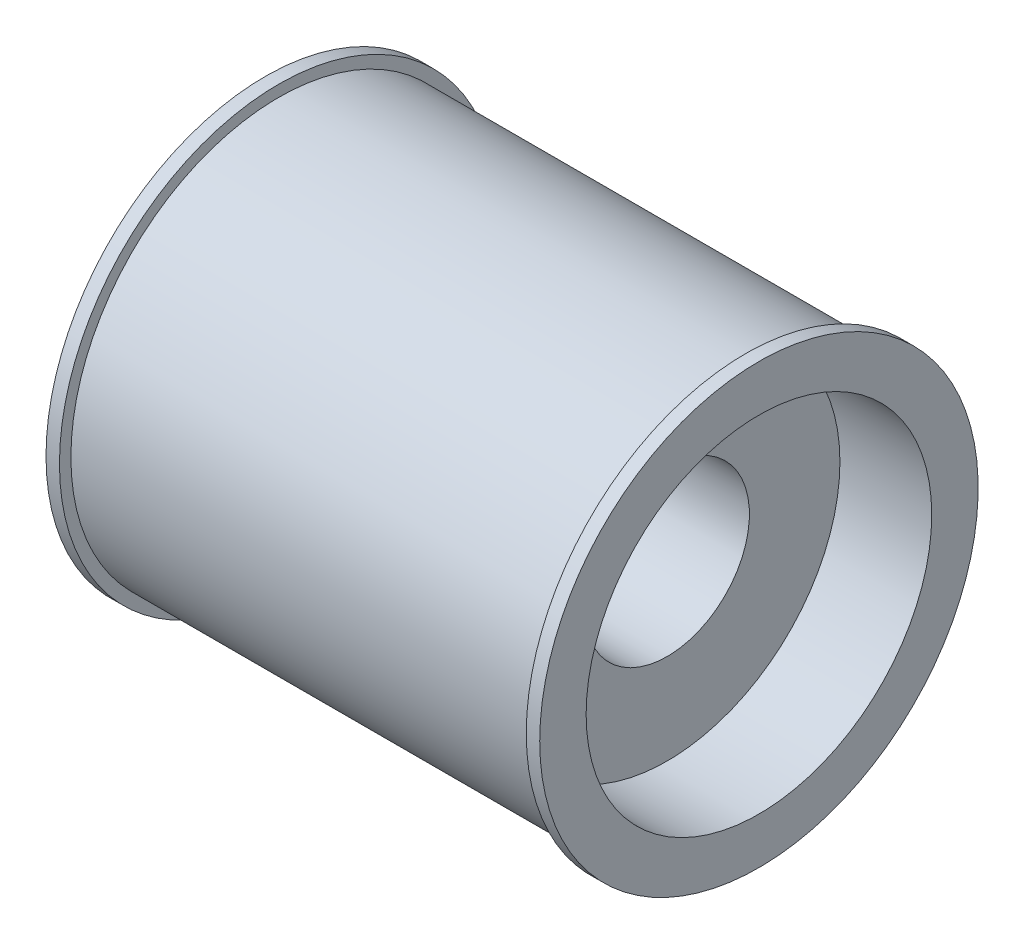
ISO-10303-21;
HEADER;
FILE_DESCRIPTION(('STEP AP214'),'2;1');
FILE_NAME('part.step','',(''),(''),'','','');
FILE_SCHEMA(('AUTOMOTIVE_DESIGN { 1 0 10303 214 1 1 1 1 }'));
ENDSEC;
DATA;
#1=APPLICATION_CONTEXT('core data for automotive mechanical design processes');
#2=APPLICATION_PROTOCOL_DEFINITION('international standard','automotive_design',2000,#1);
#3=PRODUCT_CONTEXT('',#1,'mechanical');
#4=PRODUCT('Part','Part','',(#3));
#5=PRODUCT_RELATED_PRODUCT_CATEGORY('part','',(#4));
#6=PRODUCT_DEFINITION_FORMATION('','',#4);
#7=PRODUCT_DEFINITION_CONTEXT('part definition',#1,'design');
#8=PRODUCT_DEFINITION('design','',#6,#7);
#9=PRODUCT_DEFINITION_SHAPE('','',#8);
#10=(LENGTH_UNIT() NAMED_UNIT(*) SI_UNIT(.MILLI.,.METRE.));
#11=(NAMED_UNIT(*) PLANE_ANGLE_UNIT() SI_UNIT($,.RADIAN.));
#12=(NAMED_UNIT(*) SI_UNIT($,.STERADIAN.) SOLID_ANGLE_UNIT());
#13=UNCERTAINTY_MEASURE_WITH_UNIT(LENGTH_MEASURE(1.E-05),#10,'distance_accuracy_value','');
#14=(GEOMETRIC_REPRESENTATION_CONTEXT(3) GLOBAL_UNCERTAINTY_ASSIGNED_CONTEXT((#13)) GLOBAL_UNIT_ASSIGNED_CONTEXT((#10,
#11,#12)) REPRESENTATION_CONTEXT('',''));
#15=CARTESIAN_POINT('',(0.,0.,0.));
#16=DIRECTION('',(0.,0.,1.));
#17=DIRECTION('',(1.,0.,0.));
#18=AXIS2_PLACEMENT_3D('',#15,#16,#17);
#19=CARTESIAN_POINT('',(-28.3651293747546,26.6416062425833,0.));
#20=DIRECTION('',(-1.,0.,0.));
#21=DIRECTION('',(0.,0.,1.));
#22=AXIS2_PLACEMENT_3D('',#19,#20,#21);
#23=PLANE('',#22);
#24=CARTESIAN_POINT('',(-28.3651293747546,0.,0.));
#25=DIRECTION('',(-1.,0.,0.));
#26=DIRECTION('',(0.,0.,1.));
#27=AXIS2_PLACEMENT_3D('',#24,#25,#26);
#28=CIRCLE('',#27,26.6416062425833);
#29=CARTESIAN_POINT('',(-28.3651293747546,0.,26.6416062425833));
#30=VERTEX_POINT('',#29);
#31=EDGE_CURVE('E88',#30,#30,#28,.T.);
#32=ORIENTED_EDGE('',*,*,#31,.F.);
#33=EDGE_LOOP('',(#32));
#34=FACE_BOUND('',#33,.T.);
#35=CARTESIAN_POINT('',(-28.3651293747546,0.,0.));
#36=DIRECTION('',(-1.,0.,0.));
#37=DIRECTION('',(0.,0.,1.));
#38=AXIS2_PLACEMENT_3D('',#35,#36,#37);
#39=CIRCLE('',#38,25.2519662111247);
#40=CARTESIAN_POINT('',(-28.3651293747546,0.,25.2519662111247));
#41=VERTEX_POINT('',#40);
#42=EDGE_CURVE('E10',#41,#41,#39,.T.);
#43=ORIENTED_EDGE('',*,*,#42,.T.);
#44=EDGE_LOOP('',(#43));
#45=FACE_BOUND('',#44,.T.);
#46=ADVANCED_FACE('F37',(#34,#45),#23,.F.);
#47=CARTESIAN_POINT('',(0.,0.,0.));
#48=DIRECTION('',(-1.,0.,0.));
#49=DIRECTION('',(0.,0.,1.));
#50=AXIS2_PLACEMENT_3D('',#47,#48,#49);
#51=CYLINDRICAL_SURFACE('',#50,25.2519662111247);
#52=ORIENTED_EDGE('',*,*,#42,.F.);
#53=EDGE_LOOP('',(#52));
#54=FACE_BOUND('',#53,.T.);
#55=CARTESIAN_POINT('',(28.3651293747546,0.,0.));
#56=DIRECTION('',(-1.,0.,0.));
#57=DIRECTION('',(0.,0.,1.));
#58=AXIS2_PLACEMENT_3D('',#55,#56,#57);
#59=CIRCLE('',#58,25.2519662111247);
#60=CARTESIAN_POINT('',(28.3651293747546,0.,25.2519662111247));
#61=VERTEX_POINT('',#60);
#62=EDGE_CURVE('E44',#61,#61,#59,.T.);
#63=ORIENTED_EDGE('',*,*,#62,.T.);
#64=EDGE_LOOP('',(#63));
#65=FACE_BOUND('',#64,.T.);
#66=ADVANCED_FACE('F96',(#54,#65),#51,.T.);
#67=CARTESIAN_POINT('',(28.3651293747546,26.6416062425833,0.));
#68=DIRECTION('',(1.,0.,0.));
#69=DIRECTION('',(0.,0.,-1.));
#70=AXIS2_PLACEMENT_3D('',#67,#68,#69);
#71=PLANE('',#70);
#72=ORIENTED_EDGE('',*,*,#62,.F.);
#73=EDGE_LOOP('',(#72));
#74=FACE_BOUND('',#73,.T.);
#75=CARTESIAN_POINT('',(28.3651293747546,0.,0.));
#76=DIRECTION('',(-1.,0.,0.));
#77=DIRECTION('',(0.,0.,1.));
#78=AXIS2_PLACEMENT_3D('',#75,#76,#77);
#79=CIRCLE('',#78,26.6416062425833);
#80=CARTESIAN_POINT('',(28.3651293747546,0.,26.6416062425833));
#81=VERTEX_POINT('',#80);
#82=EDGE_CURVE('E49',#81,#81,#79,.T.);
#83=ORIENTED_EDGE('',*,*,#82,.T.);
#84=EDGE_LOOP('',(#83));
#85=FACE_BOUND('',#84,.T.);
#86=ADVANCED_FACE('F100',(#74,#85),#71,.F.);
#87=CARTESIAN_POINT('',(0.,0.,0.));
#88=DIRECTION('',(-1.,0.,0.));
#89=DIRECTION('',(0.,0.,1.));
#90=AXIS2_PLACEMENT_3D('',#87,#88,#89);
#91=CYLINDRICAL_SURFACE('',#90,26.6416062425833);
#92=ORIENTED_EDGE('',*,*,#82,.F.);
#93=EDGE_LOOP('',(#92));
#94=FACE_BOUND('',#93,.T.);
#95=CARTESIAN_POINT('',(30.,0.,0.));
#96=DIRECTION('',(-1.,0.,0.));
#97=DIRECTION('',(0.,0.,1.));
#98=AXIS2_PLACEMENT_3D('',#95,#96,#97);
#99=CIRCLE('',#98,26.6416062425833);
#100=CARTESIAN_POINT('',(30.,0.,26.6416062425833));
#101=VERTEX_POINT('',#100);
#102=EDGE_CURVE('E54',#101,#101,#99,.T.);
#103=ORIENTED_EDGE('',*,*,#102,.T.);
#104=EDGE_LOOP('',(#103));
#105=FACE_BOUND('',#104,.T.);
#106=ADVANCED_FACE('F105',(#94,#105),#91,.T.);
#107=CARTESIAN_POINT('',(30.,21.,0.));
#108=DIRECTION('',(-1.,0.,0.));
#109=DIRECTION('',(0.,0.,1.));
#110=AXIS2_PLACEMENT_3D('',#107,#108,#109);
#111=PLANE('',#110);
#112=ORIENTED_EDGE('',*,*,#102,.F.);
#113=EDGE_LOOP('',(#112));
#114=FACE_BOUND('',#113,.T.);
#115=CARTESIAN_POINT('',(30.,0.,0.));
#116=DIRECTION('',(-1.,0.,0.));
#117=DIRECTION('',(0.,0.,1.));
#118=AXIS2_PLACEMENT_3D('',#115,#116,#117);
#119=CIRCLE('',#118,21.);
#120=CARTESIAN_POINT('',(30.,0.,21.));
#121=VERTEX_POINT('',#120);
#122=EDGE_CURVE('E60',#121,#121,#119,.T.);
#123=ORIENTED_EDGE('',*,*,#122,.T.);
#124=EDGE_LOOP('',(#123));
#125=FACE_BOUND('',#124,.T.);
#126=ADVANCED_FACE('F111',(#114,#125),#111,.F.);
#127=CARTESIAN_POINT('',(0.,0.,0.));
#128=DIRECTION('',(-1.,0.,0.));
#129=DIRECTION('',(0.,0.,1.));
#130=AXIS2_PLACEMENT_3D('',#127,#128,#129);
#131=CYLINDRICAL_SURFACE('',#130,21.);
#132=ORIENTED_EDGE('',*,*,#122,.F.);
#133=EDGE_LOOP('',(#132));
#134=FACE_BOUND('',#133,.T.);
#135=CARTESIAN_POINT('',(18.8432456009286,0.,0.));
#136=DIRECTION('',(-1.,0.,0.));
#137=DIRECTION('',(0.,0.,1.));
#138=AXIS2_PLACEMENT_3D('',#135,#136,#137);
#139=CIRCLE('',#138,21.);
#140=CARTESIAN_POINT('',(18.8432456009286,0.,21.));
#141=VERTEX_POINT('',#140);
#142=EDGE_CURVE('E64',#141,#141,#139,.T.);
#143=ORIENTED_EDGE('',*,*,#142,.T.);
#144=EDGE_LOOP('',(#143));
#145=FACE_BOUND('',#144,.T.);
#146=ADVANCED_FACE('F115',(#134,#145),#131,.F.);
#147=CARTESIAN_POINT('',(18.8432456009286,10.,0.));
#148=DIRECTION('',(-1.,0.,0.));
#149=DIRECTION('',(0.,0.,1.));
#150=AXIS2_PLACEMENT_3D('',#147,#148,#149);
#151=PLANE('',#150);
#152=ORIENTED_EDGE('',*,*,#142,.F.);
#153=EDGE_LOOP('',(#152));
#154=FACE_BOUND('',#153,.T.);
#155=CARTESIAN_POINT('',(18.8432456009286,0.,0.));
#156=DIRECTION('',(-1.,0.,0.));
#157=DIRECTION('',(0.,0.,1.));
#158=AXIS2_PLACEMENT_3D('',#155,#156,#157);
#159=CIRCLE('',#158,10.);
#160=CARTESIAN_POINT('',(18.8432456009286,0.,10.));
#161=VERTEX_POINT('',#160);
#162=EDGE_CURVE('E68',#161,#161,#159,.T.);
#163=ORIENTED_EDGE('',*,*,#162,.T.);
#164=EDGE_LOOP('',(#163));
#165=FACE_BOUND('',#164,.T.);
#166=ADVANCED_FACE('F119',(#154,#165),#151,.F.);
#167=CARTESIAN_POINT('',(0.,0.,0.));
#168=DIRECTION('',(-1.,0.,0.));
#169=DIRECTION('',(0.,0.,1.));
#170=AXIS2_PLACEMENT_3D('',#167,#168,#169);
#171=CYLINDRICAL_SURFACE('',#170,10.);
#172=ORIENTED_EDGE('',*,*,#162,.F.);
#173=EDGE_LOOP('',(#172));
#174=FACE_BOUND('',#173,.T.);
#175=CARTESIAN_POINT('',(-18.8432456009286,0.,0.));
#176=DIRECTION('',(-1.,0.,0.));
#177=DIRECTION('',(0.,0.,1.));
#178=AXIS2_PLACEMENT_3D('',#175,#176,#177);
#179=CIRCLE('',#178,10.);
#180=CARTESIAN_POINT('',(-18.8432456009286,0.,10.));
#181=VERTEX_POINT('',#180);
#182=EDGE_CURVE('E72',#181,#181,#179,.T.);
#183=ORIENTED_EDGE('',*,*,#182,.T.);
#184=EDGE_LOOP('',(#183));
#185=FACE_BOUND('',#184,.T.);
#186=ADVANCED_FACE('F123',(#174,#185),#171,.F.);
#187=CARTESIAN_POINT('',(-18.8432456009286,10.,0.));
#188=DIRECTION('',(1.,0.,0.));
#189=DIRECTION('',(0.,0.,-1.));
#190=AXIS2_PLACEMENT_3D('',#187,#188,#189);
#191=PLANE('',#190);
#192=ORIENTED_EDGE('',*,*,#182,.F.);
#193=EDGE_LOOP('',(#192));
#194=FACE_BOUND('',#193,.T.);
#195=CARTESIAN_POINT('',(-18.8432456009286,0.,0.));
#196=DIRECTION('',(-1.,0.,0.));
#197=DIRECTION('',(0.,0.,1.));
#198=AXIS2_PLACEMENT_3D('',#195,#196,#197);
#199=CIRCLE('',#198,21.);
#200=CARTESIAN_POINT('',(-18.8432456009286,0.,21.));
#201=VERTEX_POINT('',#200);
#202=EDGE_CURVE('E76',#201,#201,#199,.T.);
#203=ORIENTED_EDGE('',*,*,#202,.T.);
#204=EDGE_LOOP('',(#203));
#205=FACE_BOUND('',#204,.T.);
#206=ADVANCED_FACE('F127',(#194,#205),#191,.F.);
#207=CARTESIAN_POINT('',(0.,0.,0.));
#208=DIRECTION('',(-1.,0.,0.));
#209=DIRECTION('',(0.,0.,1.));
#210=AXIS2_PLACEMENT_3D('',#207,#208,#209);
#211=CYLINDRICAL_SURFACE('',#210,21.);
#212=ORIENTED_EDGE('',*,*,#202,.F.);
#213=EDGE_LOOP('',(#212));
#214=FACE_BOUND('',#213,.T.);
#215=CARTESIAN_POINT('',(-30.,0.,0.));
#216=DIRECTION('',(-1.,0.,0.));
#217=DIRECTION('',(0.,0.,1.));
#218=AXIS2_PLACEMENT_3D('',#215,#216,#217);
#219=CIRCLE('',#218,21.);
#220=CARTESIAN_POINT('',(-30.,0.,21.));
#221=VERTEX_POINT('',#220);
#222=EDGE_CURVE('E80',#221,#221,#219,.T.);
#223=ORIENTED_EDGE('',*,*,#222,.T.);
#224=EDGE_LOOP('',(#223));
#225=FACE_BOUND('',#224,.T.);
#226=ADVANCED_FACE('F131',(#214,#225),#211,.F.);
#227=CARTESIAN_POINT('',(-30.,21.,0.));
#228=DIRECTION('',(1.,0.,0.));
#229=DIRECTION('',(0.,0.,-1.));
#230=AXIS2_PLACEMENT_3D('',#227,#228,#229);
#231=PLANE('',#230);
#232=ORIENTED_EDGE('',*,*,#222,.F.);
#233=EDGE_LOOP('',(#232));
#234=FACE_BOUND('',#233,.T.);
#235=CARTESIAN_POINT('',(-30.,0.,0.));
#236=DIRECTION('',(-1.,0.,0.));
#237=DIRECTION('',(0.,0.,1.));
#238=AXIS2_PLACEMENT_3D('',#235,#236,#237);
#239=CIRCLE('',#238,26.6416062425833);
#240=CARTESIAN_POINT('',(-30.,0.,26.6416062425833));
#241=VERTEX_POINT('',#240);
#242=EDGE_CURVE('E84',#241,#241,#239,.T.);
#243=ORIENTED_EDGE('',*,*,#242,.T.);
#244=EDGE_LOOP('',(#243));
#245=FACE_BOUND('',#244,.T.);
#246=ADVANCED_FACE('F135',(#234,#245),#231,.F.);
#247=CARTESIAN_POINT('',(0.,0.,0.));
#248=DIRECTION('',(-1.,0.,0.));
#249=DIRECTION('',(0.,0.,1.));
#250=AXIS2_PLACEMENT_3D('',#247,#248,#249);
#251=CYLINDRICAL_SURFACE('',#250,26.6416062425833);
#252=ORIENTED_EDGE('',*,*,#242,.F.);
#253=EDGE_LOOP('',(#252));
#254=FACE_BOUND('',#253,.T.);
#255=ORIENTED_EDGE('',*,*,#31,.T.);
#256=EDGE_LOOP('',(#255));
#257=FACE_BOUND('',#256,.T.);
#258=ADVANCED_FACE('F93',(#254,#257),#251,.T.);
#259=CLOSED_SHELL('',(#46,#66,#86,#106,#126,#146,#166,#186,#206,#226,#246,#258));
#260=MANIFOLD_SOLID_BREP('B2',#259);
#261=ADVANCED_BREP_SHAPE_REPRESENTATION('',(#18,#260),#14);
#262=SHAPE_DEFINITION_REPRESENTATION(#9,#261);
ENDSEC;
END-ISO-10303-21;
